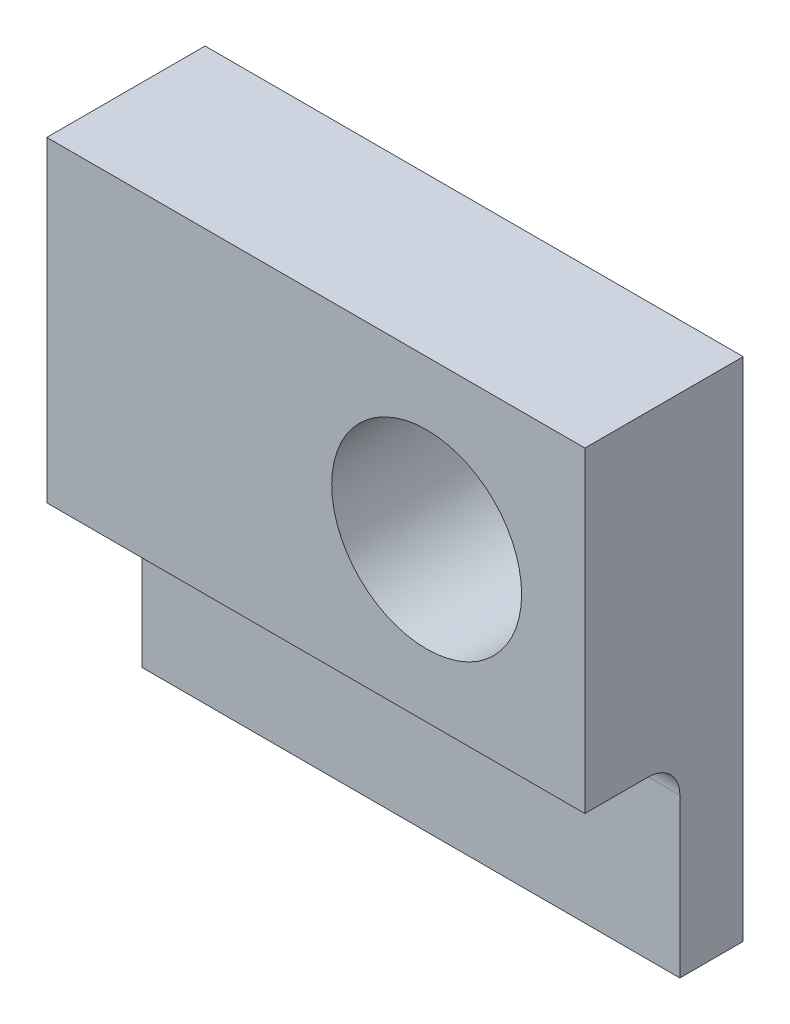
ISO-10303-21;
HEADER;
FILE_DESCRIPTION(('STEP AP214'),'2;1');
FILE_NAME('part.step','',(''),(''),'','','');
FILE_SCHEMA(('AUTOMOTIVE_DESIGN { 1 0 10303 214 1 1 1 1 }'));
ENDSEC;
DATA;
#1=APPLICATION_CONTEXT('core data for automotive mechanical design processes');
#2=APPLICATION_PROTOCOL_DEFINITION('international standard','automotive_design',2000,#1);
#3=PRODUCT_CONTEXT('',#1,'mechanical');
#4=PRODUCT('Part','Part','',(#3));
#5=PRODUCT_RELATED_PRODUCT_CATEGORY('part','',(#4));
#6=PRODUCT_DEFINITION_FORMATION('','',#4);
#7=PRODUCT_DEFINITION_CONTEXT('part definition',#1,'design');
#8=PRODUCT_DEFINITION('design','',#6,#7);
#9=PRODUCT_DEFINITION_SHAPE('','',#8);
#10=(LENGTH_UNIT() NAMED_UNIT(*) SI_UNIT(.MILLI.,.METRE.));
#11=(NAMED_UNIT(*) PLANE_ANGLE_UNIT() SI_UNIT($,.RADIAN.));
#12=(NAMED_UNIT(*) SI_UNIT($,.STERADIAN.) SOLID_ANGLE_UNIT());
#13=UNCERTAINTY_MEASURE_WITH_UNIT(LENGTH_MEASURE(1.E-05),#10,'distance_accuracy_value','');
#14=(GEOMETRIC_REPRESENTATION_CONTEXT(3) GLOBAL_UNCERTAINTY_ASSIGNED_CONTEXT((#13)) GLOBAL_UNIT_ASSIGNED_CONTEXT((#10,
#11,#12)) REPRESENTATION_CONTEXT('',''));
#15=CARTESIAN_POINT('',(0.,0.,0.));
#16=DIRECTION('',(0.,0.,1.));
#17=DIRECTION('',(1.,0.,0.));
#18=AXIS2_PLACEMENT_3D('',#15,#16,#17);
#19=CARTESIAN_POINT('',(0.,0.,5.));
#20=DIRECTION('',(0.,1.,0.));
#21=DIRECTION('',(0.,0.,1.));
#22=AXIS2_PLACEMENT_3D('',#19,#20,#21);
#23=PLANE('',#22);
#24=DIRECTION('',(0.,0.,-1.));
#25=VECTOR('',#24,1.);
#26=CARTESIAN_POINT('',(0.,0.,5.));
#27=LINE('',#26,#25);
#28=CARTESIAN_POINT('',(0.,0.,5.));
#29=VERTEX_POINT('',#28);
#30=CARTESIAN_POINT('',(0.,0.,3.));
#31=VERTEX_POINT('',#30);
#32=EDGE_CURVE('E175',#29,#31,#27,.T.);
#33=ORIENTED_EDGE('',*,*,#32,.T.);
#34=DIRECTION('',(-1.,0.,0.));
#35=VECTOR('',#34,1.);
#36=CARTESIAN_POINT('',(17.,0.,3.));
#37=LINE('',#36,#35);
#38=CARTESIAN_POINT('',(17.,0.,3.));
#39=VERTEX_POINT('',#38);
#40=EDGE_CURVE('E63',#31,#39,#37,.F.);
#41=ORIENTED_EDGE('',*,*,#40,.T.);
#42=DIRECTION('',(0.,0.,-1.));
#43=VECTOR('',#42,1.);
#44=CARTESIAN_POINT('',(17.,0.,5.));
#45=LINE('',#44,#43);
#46=CARTESIAN_POINT('',(17.,0.,5.));
#47=VERTEX_POINT('',#46);
#48=EDGE_CURVE('E172',#47,#39,#45,.T.);
#49=ORIENTED_EDGE('',*,*,#48,.F.);
#50=DIRECTION('',(1.,0.,0.));
#51=VECTOR('',#50,1.);
#52=CARTESIAN_POINT('',(0.,0.,5.));
#53=LINE('',#52,#51);
#54=EDGE_CURVE('E147',#29,#47,#53,.T.);
#55=ORIENTED_EDGE('',*,*,#54,.F.);
#56=EDGE_LOOP('',(#33,#41,#49,#55));
#57=FACE_BOUND('',#56,.T.);
#58=ADVANCED_FACE('F41',(#57),#23,.F.);
#59=CARTESIAN_POINT('',(0.,0.,5.));
#60=DIRECTION('',(0.,0.,-1.));
#61=DIRECTION('',(-1.,0.,0.));
#62=AXIS2_PLACEMENT_3D('',#59,#60,#61);
#63=PLANE('',#62);
#64=DIRECTION('',(0.,-1.,0.));
#65=VECTOR('',#64,1.);
#66=CARTESIAN_POINT('',(0.,0.,5.));
#67=LINE('',#66,#65);
#68=CARTESIAN_POINT('',(0.,10.,5.));
#69=VERTEX_POINT('',#68);
#70=EDGE_CURVE('E143',#69,#29,#67,.T.);
#71=ORIENTED_EDGE('',*,*,#70,.T.);
#72=ORIENTED_EDGE('',*,*,#54,.T.);
#73=DIRECTION('',(0.,1.,0.));
#74=VECTOR('',#73,1.);
#75=CARTESIAN_POINT('',(17.,0.,5.));
#76=LINE('',#75,#74);
#77=CARTESIAN_POINT('',(17.,10.,5.));
#78=VERTEX_POINT('',#77);
#79=EDGE_CURVE('E151',#47,#78,#76,.T.);
#80=ORIENTED_EDGE('',*,*,#79,.T.);
#81=DIRECTION('',(-1.,0.,0.));
#82=VECTOR('',#81,1.);
#83=CARTESIAN_POINT('',(0.,10.,5.));
#84=LINE('',#83,#82);
#85=EDGE_CURVE('E154',#78,#69,#84,.T.);
#86=ORIENTED_EDGE('',*,*,#85,.T.);
#87=EDGE_LOOP('',(#71,#72,#80,#86));
#88=FACE_BOUND('',#87,.T.);
#89=CARTESIAN_POINT('',(12.,5.,5.));
#90=DIRECTION('',(0.,0.,1.));
#91=DIRECTION('',(1.,0.,0.));
#92=AXIS2_PLACEMENT_3D('',#89,#90,#91);
#93=CIRCLE('',#92,3.);
#94=CARTESIAN_POINT('',(15.,5.,5.));
#95=VERTEX_POINT('',#94);
#96=EDGE_CURVE('E135',#95,#95,#93,.T.);
#97=ORIENTED_EDGE('',*,*,#96,.F.);
#98=EDGE_LOOP('',(#97));
#99=FACE_BOUND('',#98,.T.);
#100=ADVANCED_FACE('F199',(#88,#99),#63,.F.);
#101=CARTESIAN_POINT('',(0.,0.,0.));
#102=DIRECTION('',(0.,0.,-1.));
#103=DIRECTION('',(-1.,0.,0.));
#104=AXIS2_PLACEMENT_3D('',#101,#102,#103);
#105=PLANE('',#104);
#106=DIRECTION('',(0.,-1.,0.));
#107=VECTOR('',#106,1.);
#108=CARTESIAN_POINT('',(0.,0.,0.));
#109=LINE('',#108,#107);
#110=CARTESIAN_POINT('',(0.,10.,0.));
#111=VERTEX_POINT('',#110);
#112=CARTESIAN_POINT('',(0.,-6.,0.));
#113=VERTEX_POINT('',#112);
#114=EDGE_CURVE('E139',#111,#113,#109,.T.);
#115=ORIENTED_EDGE('',*,*,#114,.F.);
#116=DIRECTION('',(-1.,0.,0.));
#117=VECTOR('',#116,1.);
#118=CARTESIAN_POINT('',(0.,10.,0.));
#119=LINE('',#118,#117);
#120=CARTESIAN_POINT('',(17.,10.,0.));
#121=VERTEX_POINT('',#120);
#122=EDGE_CURVE('E148',#121,#111,#119,.T.);
#123=ORIENTED_EDGE('',*,*,#122,.F.);
#124=DIRECTION('',(0.,1.,0.));
#125=VECTOR('',#124,1.);
#126=CARTESIAN_POINT('',(17.,0.,0.));
#127=LINE('',#126,#125);
#128=CARTESIAN_POINT('',(17.,-6.,0.));
#129=VERTEX_POINT('',#128);
#130=EDGE_CURVE('E160',#129,#121,#127,.T.);
#131=ORIENTED_EDGE('',*,*,#130,.F.);
#132=DIRECTION('',(-1.,0.,0.));
#133=VECTOR('',#132,1.);
#134=CARTESIAN_POINT('',(0.,-6.,0.));
#135=LINE('',#134,#133);
#136=EDGE_CURVE('E120',#129,#113,#135,.T.);
#137=ORIENTED_EDGE('',*,*,#136,.T.);
#138=EDGE_LOOP('',(#115,#123,#131,#137));
#139=FACE_BOUND('',#138,.T.);
#140=CARTESIAN_POINT('',(12.,5.,0.));
#141=DIRECTION('',(0.,0.,1.));
#142=DIRECTION('',(1.,0.,0.));
#143=AXIS2_PLACEMENT_3D('',#140,#141,#142);
#144=CIRCLE('',#143,3.);
#145=CARTESIAN_POINT('',(15.,5.,0.));
#146=VERTEX_POINT('',#145);
#147=EDGE_CURVE('E133',#146,#146,#144,.T.);
#148=ORIENTED_EDGE('',*,*,#147,.T.);
#149=EDGE_LOOP('',(#148));
#150=FACE_BOUND('',#149,.T.);
#151=ADVANCED_FACE('F188',(#139,#150),#105,.T.);
#152=CARTESIAN_POINT('',(0.,0.,5.));
#153=DIRECTION('',(1.,0.,0.));
#154=DIRECTION('',(0.,0.,-1.));
#155=AXIS2_PLACEMENT_3D('',#152,#153,#154);
#156=PLANE('',#155);
#157=ORIENTED_EDGE('',*,*,#114,.T.);
#158=DIRECTION('',(0.,0.,-1.));
#159=VECTOR('',#158,1.);
#160=CARTESIAN_POINT('',(0.,-6.,2.));
#161=LINE('',#160,#159);
#162=CARTESIAN_POINT('',(0.,-6.,2.));
#163=VERTEX_POINT('',#162);
#164=EDGE_CURVE('E122',#163,#113,#161,.T.);
#165=ORIENTED_EDGE('',*,*,#164,.F.);
#166=DIRECTION('',(0.,-1.,0.));
#167=VECTOR('',#166,1.);
#168=CARTESIAN_POINT('',(0.,0.,2.));
#169=LINE('',#168,#167);
#170=CARTESIAN_POINT('',(0.,-1.,2.));
#171=VERTEX_POINT('',#170);
#172=EDGE_CURVE('E113',#171,#163,#169,.T.);
#173=ORIENTED_EDGE('',*,*,#172,.F.);
#174=CARTESIAN_POINT('',(0.,-1.,3.));
#175=DIRECTION('',(1.,0.,0.));
#176=DIRECTION('',(0.,0.,-1.));
#177=AXIS2_PLACEMENT_3D('',#174,#175,#176);
#178=CIRCLE('',#177,1.);
#179=EDGE_CURVE('E50',#171,#31,#178,.T.);
#180=ORIENTED_EDGE('',*,*,#179,.T.);
#181=ORIENTED_EDGE('',*,*,#32,.F.);
#182=ORIENTED_EDGE('',*,*,#70,.F.);
#183=DIRECTION('',(0.,0.,-1.));
#184=VECTOR('',#183,1.);
#185=CARTESIAN_POINT('',(0.,10.,5.));
#186=LINE('',#185,#184);
#187=EDGE_CURVE('E157',#69,#111,#186,.T.);
#188=ORIENTED_EDGE('',*,*,#187,.T.);
#189=EDGE_LOOP('',(#157,#165,#173,#180,#181,#182,#188));
#190=FACE_BOUND('',#189,.T.);
#191=ADVANCED_FACE('F184',(#190),#156,.F.);
#192=CARTESIAN_POINT('',(17.,0.,5.));
#193=DIRECTION('',(-1.,0.,0.));
#194=DIRECTION('',(0.,0.,1.));
#195=AXIS2_PLACEMENT_3D('',#192,#193,#194);
#196=PLANE('',#195);
#197=ORIENTED_EDGE('',*,*,#130,.T.);
#198=DIRECTION('',(0.,0.,-1.));
#199=VECTOR('',#198,1.);
#200=CARTESIAN_POINT('',(17.,10.,5.));
#201=LINE('',#200,#199);
#202=EDGE_CURVE('E168',#78,#121,#201,.T.);
#203=ORIENTED_EDGE('',*,*,#202,.F.);
#204=ORIENTED_EDGE('',*,*,#79,.F.);
#205=ORIENTED_EDGE('',*,*,#48,.T.);
#206=CARTESIAN_POINT('',(17.,-1.,3.));
#207=DIRECTION('',(-1.,0.,0.));
#208=DIRECTION('',(0.,0.,1.));
#209=AXIS2_PLACEMENT_3D('',#206,#207,#208);
#210=CIRCLE('',#209,1.);
#211=CARTESIAN_POINT('',(17.,-1.,2.));
#212=VERTEX_POINT('',#211);
#213=EDGE_CURVE('E11',#39,#212,#210,.T.);
#214=ORIENTED_EDGE('',*,*,#213,.T.);
#215=DIRECTION('',(0.,-1.,0.));
#216=VECTOR('',#215,1.);
#217=CARTESIAN_POINT('',(17.,0.,2.));
#218=LINE('',#217,#216);
#219=CARTESIAN_POINT('',(17.,-6.,2.));
#220=VERTEX_POINT('',#219);
#221=EDGE_CURVE('E101',#212,#220,#218,.T.);
#222=ORIENTED_EDGE('',*,*,#221,.T.);
#223=DIRECTION('',(0.,0.,-1.));
#224=VECTOR('',#223,1.);
#225=CARTESIAN_POINT('',(17.,-6.,2.));
#226=LINE('',#225,#224);
#227=EDGE_CURVE('E104',#220,#129,#226,.T.);
#228=ORIENTED_EDGE('',*,*,#227,.T.);
#229=EDGE_LOOP('',(#197,#203,#204,#205,#214,#222,#228));
#230=FACE_BOUND('',#229,.T.);
#231=ADVANCED_FACE('F103',(#230),#196,.F.);
#232=CARTESIAN_POINT('',(0.,10.,5.));
#233=DIRECTION('',(0.,-1.,0.));
#234=DIRECTION('',(0.,0.,-1.));
#235=AXIS2_PLACEMENT_3D('',#232,#233,#234);
#236=PLANE('',#235);
#237=ORIENTED_EDGE('',*,*,#122,.T.);
#238=ORIENTED_EDGE('',*,*,#187,.F.);
#239=ORIENTED_EDGE('',*,*,#85,.F.);
#240=ORIENTED_EDGE('',*,*,#202,.T.);
#241=EDGE_LOOP('',(#237,#238,#239,#240));
#242=FACE_BOUND('',#241,.T.);
#243=ADVANCED_FACE('F195',(#242),#236,.F.);
#244=CARTESIAN_POINT('',(12.,5.,5.));
#245=DIRECTION('',(0.,0.,-1.));
#246=DIRECTION('',(-1.,0.,0.));
#247=AXIS2_PLACEMENT_3D('',#244,#245,#246);
#248=CYLINDRICAL_SURFACE('',#247,3.);
#249=ORIENTED_EDGE('',*,*,#96,.T.);
#250=EDGE_LOOP('',(#249));
#251=FACE_BOUND('',#250,.T.);
#252=ORIENTED_EDGE('',*,*,#147,.F.);
#253=EDGE_LOOP('',(#252));
#254=FACE_BOUND('',#253,.T.);
#255=ADVANCED_FACE('F224',(#251,#254),#248,.F.);
#256=CARTESIAN_POINT('',(0.,-6.,2.));
#257=DIRECTION('',(0.,-1.,0.));
#258=DIRECTION('',(0.,0.,-1.));
#259=AXIS2_PLACEMENT_3D('',#256,#257,#258);
#260=PLANE('',#259);
#261=ORIENTED_EDGE('',*,*,#136,.F.);
#262=ORIENTED_EDGE('',*,*,#227,.F.);
#263=DIRECTION('',(-1.,0.,0.));
#264=VECTOR('',#263,1.);
#265=CARTESIAN_POINT('',(0.,-6.,2.));
#266=LINE('',#265,#264);
#267=EDGE_CURVE('E112',#220,#163,#266,.T.);
#268=ORIENTED_EDGE('',*,*,#267,.T.);
#269=ORIENTED_EDGE('',*,*,#164,.T.);
#270=EDGE_LOOP('',(#261,#262,#268,#269));
#271=FACE_BOUND('',#270,.T.);
#272=ADVANCED_FACE('F117',(#271),#260,.T.);
#273=CARTESIAN_POINT('',(0.,0.,2.));
#274=DIRECTION('',(0.,0.,-1.));
#275=DIRECTION('',(-1.,0.,0.));
#276=AXIS2_PLACEMENT_3D('',#273,#274,#275);
#277=PLANE('',#276);
#278=ORIENTED_EDGE('',*,*,#221,.F.);
#279=DIRECTION('',(-1.,0.,0.));
#280=VECTOR('',#279,1.);
#281=CARTESIAN_POINT('',(0.,-1.,2.));
#282=LINE('',#281,#280);
#283=EDGE_CURVE('E178',#212,#171,#282,.T.);
#284=ORIENTED_EDGE('',*,*,#283,.T.);
#285=ORIENTED_EDGE('',*,*,#172,.T.);
#286=ORIENTED_EDGE('',*,*,#267,.F.);
#287=EDGE_LOOP('',(#278,#284,#285,#286));
#288=FACE_BOUND('',#287,.T.);
#289=ADVANCED_FACE('F124',(#288),#277,.F.);
#290=CARTESIAN_POINT('',(0.,-1.,3.));
#291=DIRECTION('',(1.,0.,0.));
#292=DIRECTION('',(0.,0.,-1.));
#293=AXIS2_PLACEMENT_3D('',#290,#291,#292);
#294=CYLINDRICAL_SURFACE('',#293,1.);
#295=ORIENTED_EDGE('',*,*,#213,.F.);
#296=ORIENTED_EDGE('',*,*,#40,.F.);
#297=ORIENTED_EDGE('',*,*,#179,.F.);
#298=ORIENTED_EDGE('',*,*,#283,.F.);
#299=EDGE_LOOP('',(#295,#296,#297,#298));
#300=FACE_BOUND('',#299,.T.);
#301=ADVANCED_FACE('F43',(#300),#294,.F.);
#302=CLOSED_SHELL('',(#58,#100,#151,#191,#231,#243,#255,#272,#289,#301));
#303=MANIFOLD_SOLID_BREP('B2',#302);
#304=ADVANCED_BREP_SHAPE_REPRESENTATION('',(#18,#303),#14);
#305=SHAPE_DEFINITION_REPRESENTATION(#9,#304);
ENDSEC;
END-ISO-10303-21;
